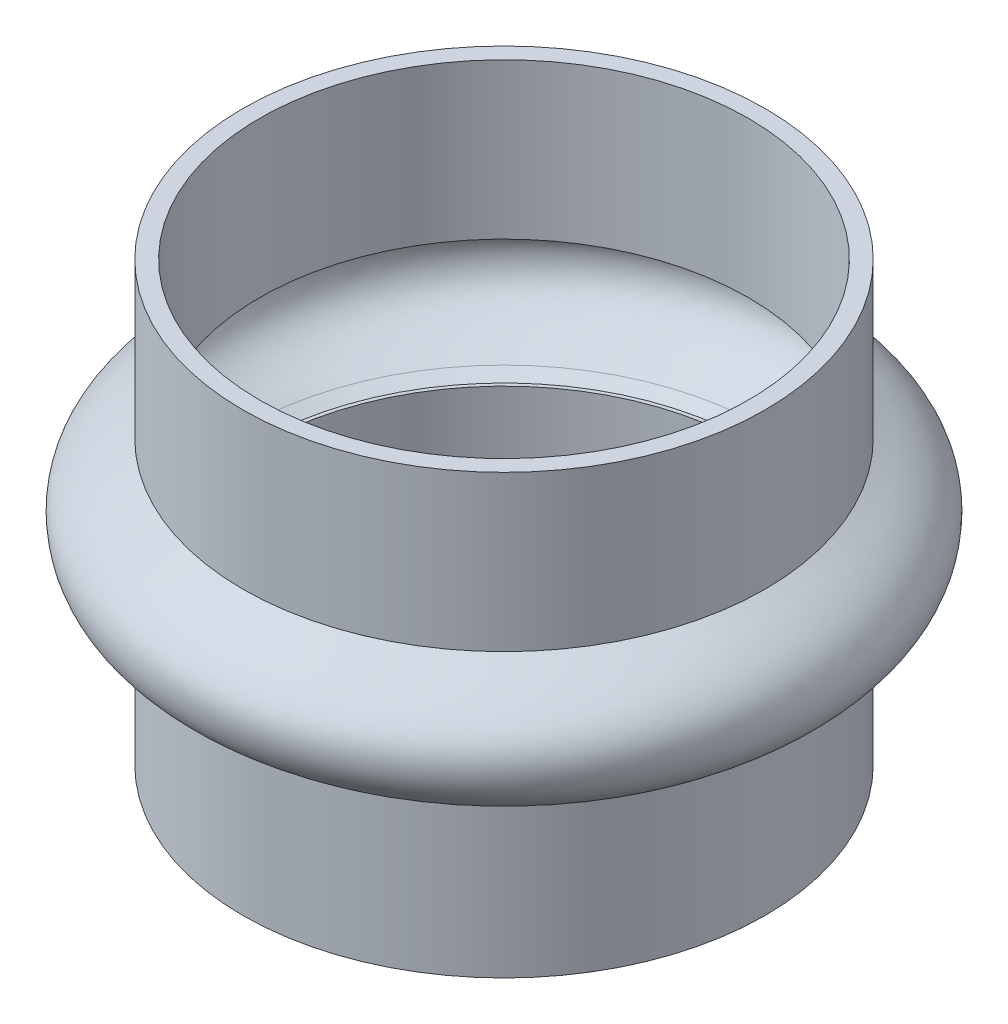
ISO-10303-21;
HEADER;
FILE_DESCRIPTION(('STEP AP214'),'2;1');
FILE_NAME('part.step','',(''),(''),'','','');
FILE_SCHEMA(('AUTOMOTIVE_DESIGN { 1 0 10303 214 1 1 1 1 }'));
ENDSEC;
DATA;
#1=APPLICATION_CONTEXT('core data for automotive mechanical design processes');
#2=APPLICATION_PROTOCOL_DEFINITION('international standard','automotive_design',2000,#1);
#3=PRODUCT_CONTEXT('',#1,'mechanical');
#4=PRODUCT('Part','Part','',(#3));
#5=PRODUCT_RELATED_PRODUCT_CATEGORY('part','',(#4));
#6=PRODUCT_DEFINITION_FORMATION('','',#4);
#7=PRODUCT_DEFINITION_CONTEXT('part definition',#1,'design');
#8=PRODUCT_DEFINITION('design','',#6,#7);
#9=PRODUCT_DEFINITION_SHAPE('','',#8);
#10=(LENGTH_UNIT() NAMED_UNIT(*) SI_UNIT(.MILLI.,.METRE.));
#11=(NAMED_UNIT(*) PLANE_ANGLE_UNIT() SI_UNIT($,.RADIAN.));
#12=(NAMED_UNIT(*) SI_UNIT($,.STERADIAN.) SOLID_ANGLE_UNIT());
#13=UNCERTAINTY_MEASURE_WITH_UNIT(LENGTH_MEASURE(1.E-05),#10,'distance_accuracy_value','');
#14=(GEOMETRIC_REPRESENTATION_CONTEXT(3) GLOBAL_UNCERTAINTY_ASSIGNED_CONTEXT((#13)) GLOBAL_UNIT_ASSIGNED_CONTEXT((#10,
#11,#12)) REPRESENTATION_CONTEXT('',''));
#15=CARTESIAN_POINT('',(0.,0.,0.));
#16=DIRECTION('',(0.,0.,1.));
#17=DIRECTION('',(1.,0.,0.));
#18=AXIS2_PLACEMENT_3D('',#15,#16,#17);
#19=CARTESIAN_POINT('',(7.32527885416046,63.4118839536714,0.));
#20=CARTESIAN_POINT('',(6.01113524448012,62.7300548837443,0.));
#21=CARTESIAN_POINT('',(2.97178340482834,61.4251647000728,0.));
#22=CARTESIAN_POINT('',(3.46335156981875,56.9126049959074,0.));
#23=CARTESIAN_POINT('',(5.94264008540045,55.867892062733,0.));
#24=CARTESIAN_POINT('',(7.13175859484,55.2111567601479,0.));
#25=B_SPLINE_CURVE_WITH_KNOTS('',3,(#19,#20,#21,#22,#23,#24),.UNSPECIFIED.,.F.,.F.,(4,1,1,4),
(0.,0.430000258288569,0.624673055244475,1.),.UNSPECIFIED.);
#26=CARTESIAN_POINT('',(24.1402788541605,76.5393428738392,0.));
#27=DIRECTION('',(0.,1.,0.));
#28=AXIS1_PLACEMENT('',#26,#27);
#29=SURFACE_OF_REVOLUTION('',#25,#28);
#30=CARTESIAN_POINT('',(24.1402788541605,55.211156760148,0.));
#31=DIRECTION('',(0.,1.,0.));
#32=DIRECTION('',(-1.,0.,0.));
#33=AXIS2_PLACEMENT_3D('',#30,#31,#32);
#34=CIRCLE('',#33,17.0085202593204);
#35=CARTESIAN_POINT('',(7.13175859484001,55.211156760148,0.));
#36=VERTEX_POINT('',#35);
#37=EDGE_CURVE('E10',#36,#36,#34,.T.);
#38=ORIENTED_EDGE('',*,*,#37,.T.);
#39=EDGE_LOOP('',(#38));
#40=FACE_BOUND('',#39,.T.);
#41=CARTESIAN_POINT('',(24.1402788541605,63.4118839536714,0.));
#42=DIRECTION('',(0.,1.,0.));
#43=DIRECTION('',(-1.,0.,0.));
#44=AXIS2_PLACEMENT_3D('',#41,#42,#43);
#45=CIRCLE('',#44,16.815);
#46=CARTESIAN_POINT('',(7.32527885416046,63.4118839536714,0.));
#47=VERTEX_POINT('',#46);
#48=EDGE_CURVE('E61',#47,#47,#45,.T.);
#49=ORIENTED_EDGE('',*,*,#48,.F.);
#50=EDGE_LOOP('',(#49));
#51=FACE_BOUND('',#50,.T.);
#52=ADVANCED_FACE('F37',(#40,#51),#29,.F.);
#53=CARTESIAN_POINT('',(8.16598021867365,55.211156760148,0.));
#54=DIRECTION('',(0.,-1.,0.));
#55=DIRECTION('',(1.,0.,0.));
#56=AXIS2_PLACEMENT_3D('',#53,#54,#55);
#57=PLANE('',#56);
#58=CARTESIAN_POINT('',(24.1402788541605,55.2111567601479,0.));
#59=DIRECTION('',(0.,1.,0.));
#60=DIRECTION('',(0.,0.,1.));
#61=AXIS2_PLACEMENT_3D('',#58,#59,#60);
#62=CIRCLE('',#61,16.815);
#63=CARTESIAN_POINT('',(24.1402788541605,55.2111567601479,16.815));
#64=VERTEX_POINT('',#63);
#65=EDGE_CURVE('E96',#64,#64,#62,.T.);
#66=ORIENTED_EDGE('',*,*,#65,.T.);
#67=EDGE_LOOP('',(#66));
#68=FACE_BOUND('',#67,.T.);
#69=ORIENTED_EDGE('',*,*,#37,.F.);
#70=EDGE_LOOP('',(#69));
#71=FACE_BOUND('',#70,.T.);
#72=ADVANCED_FACE('F86',(#68,#71),#57,.T.);
#73=CARTESIAN_POINT('',(24.1402788541605,55.211156760148,0.));
#74=DIRECTION('',(0.,1.,0.));
#75=DIRECTION('',(-1.,0.,0.));
#76=AXIS2_PLACEMENT_3D('',#73,#74,#75);
#77=CONICAL_SURFACE('',#76,15.9742986354868,1.0661985655365);
#78=CARTESIAN_POINT('',(24.1402788541605,55.6488412650065,0.));
#79=DIRECTION('',(0.,1.,0.));
#80=DIRECTION('',(-1.,0.,0.));
#81=AXIS2_PLACEMENT_3D('',#78,#79,#80);
#82=CIRCLE('',#81,16.7667925732629);
#83=CARTESIAN_POINT('',(7.37348628089757,55.6488412650065,0.));
#84=VERTEX_POINT('',#83);
#85=EDGE_CURVE('E50',#84,#84,#82,.T.);
#86=ORIENTED_EDGE('',*,*,#85,.T.);
#87=EDGE_LOOP('',(#86));
#88=FACE_BOUND('',#87,.T.);
#89=CARTESIAN_POINT('',(24.1402788541605,55.211156760148,0.));
#90=DIRECTION('',(0.,1.,0.));
#91=DIRECTION('',(-1.,0.,0.));
#92=AXIS2_PLACEMENT_3D('',#89,#90,#91);
#93=CIRCLE('',#92,15.9742986354868);
#94=CARTESIAN_POINT('',(8.16598021867365,55.211156760148,0.));
#95=VERTEX_POINT('',#94);
#96=EDGE_CURVE('E45',#95,#95,#93,.T.);
#97=ORIENTED_EDGE('',*,*,#96,.F.);
#98=EDGE_LOOP('',(#97));
#99=FACE_BOUND('',#98,.T.);
#100=ADVANCED_FACE('F82',(#88,#99),#77,.F.);
#101=CARTESIAN_POINT('',(7.37348628089757,55.6488412650065,0.));
#102=CARTESIAN_POINT('',(6.94927786526421,55.8831262752797,0.));
#103=CARTESIAN_POINT('',(6.08596344010193,56.3113793414857,0.));
#104=CARTESIAN_POINT('',(4.83183781803493,57.1065516861268,0.));
#105=CARTESIAN_POINT('',(3.98998944217818,58.0646968706636,0.));
#106=CARTESIAN_POINT('',(3.73463050414133,59.1781793514421,0.));
#107=CARTESIAN_POINT('',(3.84359558060863,60.0137583984932,0.));
#108=CARTESIAN_POINT('',(4.15954484014883,60.7257045834839,0.));
#109=CARTESIAN_POINT('',(4.95450233993011,61.5405908742814,0.));
#110=CARTESIAN_POINT('',(6.05410486957729,62.2018426288294,0.));
#111=CARTESIAN_POINT('',(6.94714467288609,62.6603874787557,0.));
#112=CARTESIAN_POINT('',(7.34999990981553,62.8614176513628,0.));
#113=CARTESIAN_POINT('',(7.55554955647946,62.9680648422606,0.));
#114=B_SPLINE_CURVE_WITH_KNOTS('',3,(#101,#102,#103,#104,#105,#106,#107,#108,#109,#110,#111,
#112,#113),.UNSPECIFIED.,.F.,.F.,(4,1,1,1,1,1,1,1,1,1,4),(0.,0.125,0.25,0.375,0.5,0.5625,0.625,
0.75,0.875,0.9375,1.),.UNSPECIFIED.);
#115=CARTESIAN_POINT('',(24.1402788541605,76.5393428738392,0.));
#116=DIRECTION('',(0.,1.,0.));
#117=AXIS1_PLACEMENT('',#115,#116);
#118=SURFACE_OF_REVOLUTION('',#114,#117);
#119=CARTESIAN_POINT('',(24.1402788541605,62.9680648422606,0.));
#120=DIRECTION('',(0.,1.,0.));
#121=DIRECTION('',(-1.,0.,0.));
#122=AXIS2_PLACEMENT_3D('',#119,#120,#121);
#123=CIRCLE('',#122,16.584729297681);
#124=CARTESIAN_POINT('',(7.55554955647946,62.9680648422606,0.));
#125=VERTEX_POINT('',#124);
#126=EDGE_CURVE('E55',#125,#125,#123,.T.);
#127=ORIENTED_EDGE('',*,*,#126,.T.);
#128=EDGE_LOOP('',(#127));
#129=FACE_BOUND('',#128,.T.);
#130=ORIENTED_EDGE('',*,*,#85,.F.);
#131=EDGE_LOOP('',(#130));
#132=FACE_BOUND('',#131,.T.);
#133=ADVANCED_FACE('F77',(#129,#132),#118,.F.);
#134=CARTESIAN_POINT('',(24.1402788541605,62.9680648422606,0.));
#135=DIRECTION('',(0.,-1.,0.));
#136=DIRECTION('',(1.,0.,0.));
#137=AXIS2_PLACEMENT_3D('',#134,#135,#136);
#138=CONICAL_SURFACE('',#137,16.584729297681,1.09219128631746);
#139=CARTESIAN_POINT('',(24.1402788541605,63.4118839536714,0.));
#140=DIRECTION('',(0.,1.,0.));
#141=DIRECTION('',(0.,0.,1.));
#142=AXIS2_PLACEMENT_3D('',#139,#140,#141);
#143=CIRCLE('',#142,15.7293212858505);
#144=CARTESIAN_POINT('',(24.1402788541605,63.4118839536714,15.7293212858505));
#145=VERTEX_POINT('',#144);
#146=EDGE_CURVE('E105',#145,#145,#143,.T.);
#147=ORIENTED_EDGE('',*,*,#146,.T.);
#148=EDGE_LOOP('',(#147));
#149=FACE_BOUND('',#148,.T.);
#150=ORIENTED_EDGE('',*,*,#126,.F.);
#151=EDGE_LOOP('',(#150));
#152=FACE_BOUND('',#151,.T.);
#153=ADVANCED_FACE('F81',(#149,#152),#138,.F.);
#154=CARTESIAN_POINT('',(24.1402788541605,73.4118839536714,0.));
#155=DIRECTION('',(0.,1.,0.));
#156=DIRECTION('',(0.,0.,1.));
#157=AXIS2_PLACEMENT_3D('',#154,#155,#156);
#158=PLANE('',#157);
#159=CARTESIAN_POINT('',(24.1402788541605,73.4118839536714,0.));
#160=DIRECTION('',(0.,1.,0.));
#161=DIRECTION('',(0.,0.,1.));
#162=AXIS2_PLACEMENT_3D('',#159,#160,#161);
#163=CIRCLE('',#162,16.815);
#164=CARTESIAN_POINT('',(24.1402788541605,73.4118839536714,16.815));
#165=VERTEX_POINT('',#164);
#166=EDGE_CURVE('E65',#165,#165,#163,.T.);
#167=ORIENTED_EDGE('',*,*,#166,.T.);
#168=EDGE_LOOP('',(#167));
#169=FACE_BOUND('',#168,.T.);
#170=CARTESIAN_POINT('',(24.1402788541605,73.4118839536714,0.));
#171=DIRECTION('',(0.,1.,0.));
#172=DIRECTION('',(0.,0.,1.));
#173=AXIS2_PLACEMENT_3D('',#170,#171,#172);
#174=CIRCLE('',#173,15.7293212858505);
#175=CARTESIAN_POINT('',(24.1402788541605,73.4118839536714,15.7293212858505));
#176=VERTEX_POINT('',#175);
#177=EDGE_CURVE('E112',#176,#176,#174,.T.);
#178=ORIENTED_EDGE('',*,*,#177,.F.);
#179=EDGE_LOOP('',(#178));
#180=FACE_BOUND('',#179,.T.);
#181=ADVANCED_FACE('F122',(#169,#180),#158,.T.);
#182=CARTESIAN_POINT('',(24.1402788541605,73.4118839536714,0.));
#183=DIRECTION('',(0.,-1.,0.));
#184=DIRECTION('',(0.,0.,-1.));
#185=AXIS2_PLACEMENT_3D('',#182,#183,#184);
#186=CYLINDRICAL_SURFACE('',#185,16.815);
#187=ORIENTED_EDGE('',*,*,#166,.F.);
#188=EDGE_LOOP('',(#187));
#189=FACE_BOUND('',#188,.T.);
#190=ORIENTED_EDGE('',*,*,#48,.T.);
#191=EDGE_LOOP('',(#190));
#192=FACE_BOUND('',#191,.T.);
#193=ADVANCED_FACE('F125',(#189,#192),#186,.T.);
#194=CARTESIAN_POINT('',(24.1402788541605,73.4118839536714,0.));
#195=DIRECTION('',(0.,-1.,0.));
#196=DIRECTION('',(0.,0.,-1.));
#197=AXIS2_PLACEMENT_3D('',#194,#195,#196);
#198=CYLINDRICAL_SURFACE('',#197,15.7293212858505);
#199=ORIENTED_EDGE('',*,*,#177,.T.);
#200=EDGE_LOOP('',(#199));
#201=FACE_BOUND('',#200,.T.);
#202=ORIENTED_EDGE('',*,*,#146,.F.);
#203=EDGE_LOOP('',(#202));
#204=FACE_BOUND('',#203,.T.);
#205=ADVANCED_FACE('F128',(#201,#204),#198,.F.);
#206=CARTESIAN_POINT('',(24.1402788541605,55.2111567601479,0.));
#207=DIRECTION('',(0.,-1.,0.));
#208=DIRECTION('',(0.,0.,1.));
#209=AXIS2_PLACEMENT_3D('',#206,#207,#208);
#210=PLANE('',#209);
#211=CARTESIAN_POINT('',(24.1402788541605,55.2111567601479,0.));
#212=DIRECTION('',(0.,1.,0.));
#213=DIRECTION('',(0.,0.,1.));
#214=AXIS2_PLACEMENT_3D('',#211,#212,#213);
#215=CIRCLE('',#214,15.7293212858505);
#216=CARTESIAN_POINT('',(24.1402788541605,55.2111567601479,15.7293212858505));
#217=VERTEX_POINT('',#216);
#218=EDGE_CURVE('E108',#217,#217,#215,.T.);
#219=ORIENTED_EDGE('',*,*,#218,.F.);
#220=EDGE_LOOP('',(#219));
#221=FACE_BOUND('',#220,.T.);
#222=ORIENTED_EDGE('',*,*,#96,.T.);
#223=EDGE_LOOP('',(#222));
#224=FACE_BOUND('',#223,.T.);
#225=ADVANCED_FACE('F135',(#221,#224),#210,.F.);
#226=CARTESIAN_POINT('',(24.1402788541605,45.2111567601479,0.));
#227=DIRECTION('',(0.,1.,0.));
#228=DIRECTION('',(0.,0.,1.));
#229=AXIS2_PLACEMENT_3D('',#226,#227,#228);
#230=CYLINDRICAL_SURFACE('',#229,16.815);
#231=CARTESIAN_POINT('',(24.1402788541605,45.2111567601479,0.));
#232=DIRECTION('',(0.,1.,0.));
#233=DIRECTION('',(0.,0.,1.));
#234=AXIS2_PLACEMENT_3D('',#231,#232,#233);
#235=CIRCLE('',#234,16.815);
#236=CARTESIAN_POINT('',(24.1402788541605,45.2111567601479,16.815));
#237=VERTEX_POINT('',#236);
#238=EDGE_CURVE('E99',#237,#237,#235,.T.);
#239=ORIENTED_EDGE('',*,*,#238,.T.);
#240=EDGE_LOOP('',(#239));
#241=FACE_BOUND('',#240,.T.);
#242=ORIENTED_EDGE('',*,*,#65,.F.);
#243=EDGE_LOOP('',(#242));
#244=FACE_BOUND('',#243,.T.);
#245=ADVANCED_FACE('F140',(#241,#244),#230,.T.);
#246=CARTESIAN_POINT('',(24.1402788541605,45.2111567601479,0.));
#247=DIRECTION('',(0.,-1.,0.));
#248=DIRECTION('',(0.,0.,1.));
#249=AXIS2_PLACEMENT_3D('',#246,#247,#248);
#250=PLANE('',#249);
#251=CARTESIAN_POINT('',(24.1402788541605,45.2111567601479,0.));
#252=DIRECTION('',(0.,1.,0.));
#253=DIRECTION('',(0.,0.,1.));
#254=AXIS2_PLACEMENT_3D('',#251,#252,#253);
#255=CIRCLE('',#254,15.7293212858505);
#256=CARTESIAN_POINT('',(24.1402788541605,45.2111567601479,15.7293212858505));
#257=VERTEX_POINT('',#256);
#258=EDGE_CURVE('E100',#257,#257,#255,.T.);
#259=ORIENTED_EDGE('',*,*,#258,.T.);
#260=EDGE_LOOP('',(#259));
#261=FACE_BOUND('',#260,.T.);
#262=ORIENTED_EDGE('',*,*,#238,.F.);
#263=EDGE_LOOP('',(#262));
#264=FACE_BOUND('',#263,.T.);
#265=ADVANCED_FACE('F143',(#261,#264),#250,.T.);
#266=CARTESIAN_POINT('',(24.1402788541605,45.2111567601479,0.));
#267=DIRECTION('',(0.,1.,0.));
#268=DIRECTION('',(0.,0.,1.));
#269=AXIS2_PLACEMENT_3D('',#266,#267,#268);
#270=CYLINDRICAL_SURFACE('',#269,15.7293212858505);
#271=ORIENTED_EDGE('',*,*,#258,.F.);
#272=EDGE_LOOP('',(#271));
#273=FACE_BOUND('',#272,.T.);
#274=ORIENTED_EDGE('',*,*,#218,.T.);
#275=EDGE_LOOP('',(#274));
#276=FACE_BOUND('',#275,.T.);
#277=ADVANCED_FACE('F150',(#273,#276),#270,.F.);
#278=CLOSED_SHELL('',(#52,#72,#100,#133,#153,#181,#193,#205,#225,#245,#265,#277));
#279=MANIFOLD_SOLID_BREP('B2',#278);
#280=ADVANCED_BREP_SHAPE_REPRESENTATION('',(#18,#279),#14);
#281=SHAPE_DEFINITION_REPRESENTATION(#9,#280);
ENDSEC;
END-ISO-10303-21;
